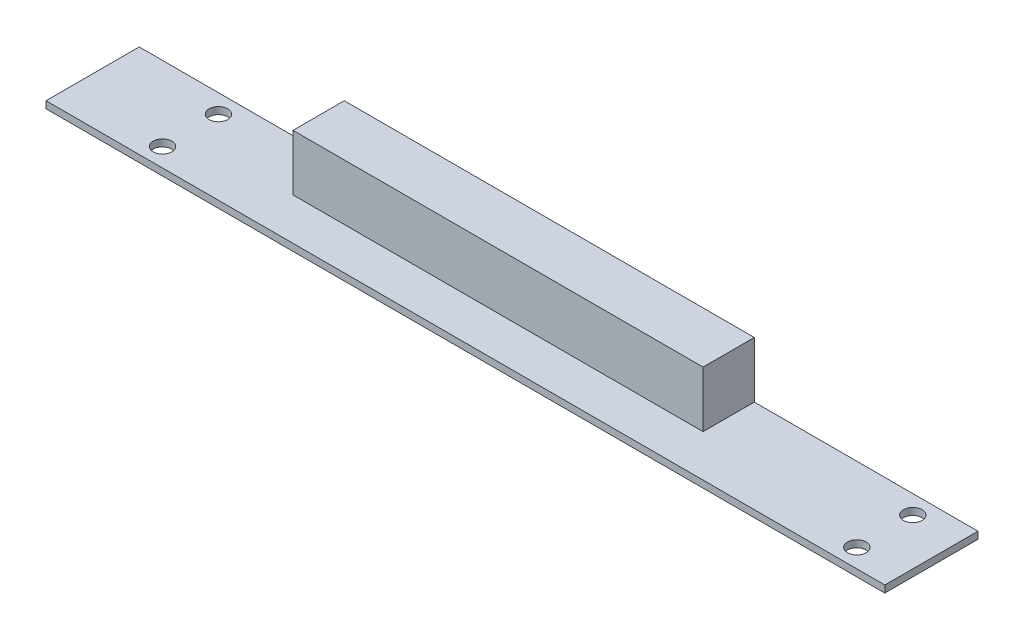
ISO-10303-21;
HEADER;
FILE_DESCRIPTION(('STEP AP214'),'2;1');
FILE_NAME('part.step','',(''),(''),'','','');
FILE_SCHEMA(('AUTOMOTIVE_DESIGN { 1 0 10303 214 1 1 1 1 }'));
ENDSEC;
DATA;
#1=APPLICATION_CONTEXT('core data for automotive mechanical design processes');
#2=APPLICATION_PROTOCOL_DEFINITION('international standard','automotive_design',2000,#1);
#3=PRODUCT_CONTEXT('',#1,'mechanical');
#4=PRODUCT('Part','Part','',(#3));
#5=PRODUCT_RELATED_PRODUCT_CATEGORY('part','',(#4));
#6=PRODUCT_DEFINITION_FORMATION('','',#4);
#7=PRODUCT_DEFINITION_CONTEXT('part definition',#1,'design');
#8=PRODUCT_DEFINITION('design','',#6,#7);
#9=PRODUCT_DEFINITION_SHAPE('','',#8);
#10=(LENGTH_UNIT() NAMED_UNIT(*) SI_UNIT(.MILLI.,.METRE.));
#11=(NAMED_UNIT(*) PLANE_ANGLE_UNIT() SI_UNIT($,.RADIAN.));
#12=(NAMED_UNIT(*) SI_UNIT($,.STERADIAN.) SOLID_ANGLE_UNIT());
#13=UNCERTAINTY_MEASURE_WITH_UNIT(LENGTH_MEASURE(1.E-05),#10,'distance_accuracy_value','');
#14=(GEOMETRIC_REPRESENTATION_CONTEXT(3) GLOBAL_UNCERTAINTY_ASSIGNED_CONTEXT((#13)) GLOBAL_UNIT_ASSIGNED_CONTEXT((#10,
#11,#12)) REPRESENTATION_CONTEXT('',''));
#15=CARTESIAN_POINT('',(0.,0.,0.));
#16=DIRECTION('',(0.,0.,1.));
#17=DIRECTION('',(1.,0.,0.));
#18=AXIS2_PLACEMENT_3D('',#15,#16,#17);
#19=CARTESIAN_POINT('',(89.9999999999999,1.5,-10.));
#20=DIRECTION('',(0.,-1.,0.));
#21=DIRECTION('',(0.,0.,-1.));
#22=AXIS2_PLACEMENT_3D('',#19,#20,#21);
#23=PLANE('',#22);
#24=CARTESIAN_POINT('',(79.9999999999999,1.5,6.));
#25=DIRECTION('',(0.,1.,0.));
#26=DIRECTION('',(0.,0.,1.));
#27=AXIS2_PLACEMENT_3D('',#24,#25,#26);
#28=CIRCLE('',#27,2.);
#29=CARTESIAN_POINT('',(79.9999999999999,1.5,8.));
#30=VERTEX_POINT('',#29);
#31=EDGE_CURVE('E120',#30,#30,#28,.T.);
#32=ORIENTED_EDGE('',*,*,#31,.F.);
#33=EDGE_LOOP('',(#32));
#34=FACE_BOUND('',#33,.T.);
#35=CARTESIAN_POINT('',(-69.,1.5,6.));
#36=DIRECTION('',(0.,1.,0.));
#37=DIRECTION('',(0.,0.,1.));
#38=AXIS2_PLACEMENT_3D('',#35,#36,#37);
#39=CIRCLE('',#38,2.);
#40=CARTESIAN_POINT('',(-69.,1.5,8.));
#41=VERTEX_POINT('',#40);
#42=EDGE_CURVE('E135',#41,#41,#39,.T.);
#43=ORIENTED_EDGE('',*,*,#42,.F.);
#44=EDGE_LOOP('',(#43));
#45=FACE_BOUND('',#44,.T.);
#46=CARTESIAN_POINT('',(-69.,1.5,-6.));
#47=DIRECTION('',(0.,1.,0.));
#48=DIRECTION('',(0.,0.,1.));
#49=AXIS2_PLACEMENT_3D('',#46,#47,#48);
#50=CIRCLE('',#49,2.);
#51=CARTESIAN_POINT('',(-69.,1.5,-4.));
#52=VERTEX_POINT('',#51);
#53=EDGE_CURVE('E141',#52,#52,#50,.T.);
#54=ORIENTED_EDGE('',*,*,#53,.F.);
#55=EDGE_LOOP('',(#54));
#56=FACE_BOUND('',#55,.T.);
#57=CARTESIAN_POINT('',(79.9999999999999,1.5,-6.));
#58=DIRECTION('',(0.,1.,0.));
#59=DIRECTION('',(0.,0.,1.));
#60=AXIS2_PLACEMENT_3D('',#57,#58,#59);
#61=CIRCLE('',#60,2.);
#62=CARTESIAN_POINT('',(79.9999999999999,1.5,-4.));
#63=VERTEX_POINT('',#62);
#64=EDGE_CURVE('E129',#63,#63,#61,.T.);
#65=ORIENTED_EDGE('',*,*,#64,.F.);
#66=EDGE_LOOP('',(#65));
#67=FACE_BOUND('',#66,.T.);
#68=DIRECTION('',(0.,0.,1.));
#69=VECTOR('',#68,1.);
#70=CARTESIAN_POINT('',(-46.0000000000001,1.5,-10.));
#71=LINE('',#70,#69);
#72=CARTESIAN_POINT('',(-46.0000000000001,1.5,-10.));
#73=VERTEX_POINT('',#72);
#74=CARTESIAN_POINT('',(-46.0000000000001,1.5,1.));
#75=VERTEX_POINT('',#74);
#76=EDGE_CURVE('E52',#73,#75,#71,.T.);
#77=ORIENTED_EDGE('',*,*,#76,.F.);
#78=DIRECTION('',(-1.,0.,0.));
#79=VECTOR('',#78,1.);
#80=CARTESIAN_POINT('',(-90.0000000000001,1.5,-10.));
#81=LINE('',#80,#79);
#82=CARTESIAN_POINT('',(-90.0000000000001,1.5,-10.));
#83=VERTEX_POINT('',#82);
#84=EDGE_CURVE('E150',#73,#83,#81,.T.);
#85=ORIENTED_EDGE('',*,*,#84,.T.);
#86=DIRECTION('',(0.,0.,1.));
#87=VECTOR('',#86,1.);
#88=CARTESIAN_POINT('',(-90.0000000000001,1.5,10.));
#89=LINE('',#88,#87);
#90=CARTESIAN_POINT('',(-90.0000000000001,1.5,10.));
#91=VERTEX_POINT('',#90);
#92=EDGE_CURVE('E154',#83,#91,#89,.T.);
#93=ORIENTED_EDGE('',*,*,#92,.T.);
#94=DIRECTION('',(1.,0.,0.));
#95=VECTOR('',#94,1.);
#96=CARTESIAN_POINT('',(-90.0000000000001,1.5,10.));
#97=LINE('',#96,#95);
#98=CARTESIAN_POINT('',(89.9999999999999,1.5,10.));
#99=VERTEX_POINT('',#98);
#100=EDGE_CURVE('E170',#91,#99,#97,.T.);
#101=ORIENTED_EDGE('',*,*,#100,.T.);
#102=DIRECTION('',(0.,0.,-1.));
#103=VECTOR('',#102,1.);
#104=CARTESIAN_POINT('',(89.9999999999999,1.5,10.));
#105=LINE('',#104,#103);
#106=CARTESIAN_POINT('',(89.9999999999999,1.5,-10.));
#107=VERTEX_POINT('',#106);
#108=EDGE_CURVE('E147',#99,#107,#105,.T.);
#109=ORIENTED_EDGE('',*,*,#108,.T.);
#110=CARTESIAN_POINT('',(41.9999999999998,1.5,-10.));
#111=VERTEX_POINT('',#110);
#112=EDGE_CURVE('E160',#107,#111,#81,.T.);
#113=ORIENTED_EDGE('',*,*,#112,.T.);
#114=DIRECTION('',(0.,0.,-1.));
#115=VECTOR('',#114,1.);
#116=CARTESIAN_POINT('',(41.9999999999999,1.5,-10.));
#117=LINE('',#116,#115);
#118=CARTESIAN_POINT('',(41.9999999999999,1.5,0.999999999999994));
#119=VERTEX_POINT('',#118);
#120=EDGE_CURVE('E114',#119,#111,#117,.T.);
#121=ORIENTED_EDGE('',*,*,#120,.F.);
#122=DIRECTION('',(1.,0.,0.));
#123=VECTOR('',#122,1.);
#124=CARTESIAN_POINT('',(-46.0000000000001,1.5,1.));
#125=LINE('',#124,#123);
#126=EDGE_CURVE('E47',#75,#119,#125,.T.);
#127=ORIENTED_EDGE('',*,*,#126,.F.);
#128=EDGE_LOOP('',(#77,#85,#93,#101,#109,#113,#121,#127));
#129=FACE_BOUND('',#128,.T.);
#130=ADVANCED_FACE('F30',(#34,#45,#56,#67,#129),#23,.F.);
#131=CARTESIAN_POINT('',(89.9999999999999,0.,-10.));
#132=DIRECTION('',(0.,-1.,0.));
#133=DIRECTION('',(0.,0.,-1.));
#134=AXIS2_PLACEMENT_3D('',#131,#132,#133);
#135=PLANE('',#134);
#136=CARTESIAN_POINT('',(79.9999999999999,0.,-6.));
#137=DIRECTION('',(0.,1.,0.));
#138=DIRECTION('',(0.,0.,1.));
#139=AXIS2_PLACEMENT_3D('',#136,#137,#138);
#140=CIRCLE('',#139,2.);
#141=CARTESIAN_POINT('',(79.9999999999999,0.,-4.));
#142=VERTEX_POINT('',#141);
#143=EDGE_CURVE('E127',#142,#142,#140,.T.);
#144=ORIENTED_EDGE('',*,*,#143,.T.);
#145=EDGE_LOOP('',(#144));
#146=FACE_BOUND('',#145,.T.);
#147=CARTESIAN_POINT('',(-69.,0.,-6.));
#148=DIRECTION('',(0.,1.,0.));
#149=DIRECTION('',(0.,0.,1.));
#150=AXIS2_PLACEMENT_3D('',#147,#148,#149);
#151=CIRCLE('',#150,2.);
#152=CARTESIAN_POINT('',(-69.,0.,-4.));
#153=VERTEX_POINT('',#152);
#154=EDGE_CURVE('E138',#153,#153,#151,.T.);
#155=ORIENTED_EDGE('',*,*,#154,.T.);
#156=EDGE_LOOP('',(#155));
#157=FACE_BOUND('',#156,.T.);
#158=DIRECTION('',(0.,0.,-1.));
#159=VECTOR('',#158,1.);
#160=CARTESIAN_POINT('',(89.9999999999999,0.,10.));
#161=LINE('',#160,#159);
#162=CARTESIAN_POINT('',(89.9999999999999,0.,10.));
#163=VERTEX_POINT('',#162);
#164=CARTESIAN_POINT('',(89.9999999999999,0.,-10.));
#165=VERTEX_POINT('',#164);
#166=EDGE_CURVE('E144',#163,#165,#161,.T.);
#167=ORIENTED_EDGE('',*,*,#166,.F.);
#168=DIRECTION('',(1.,0.,0.));
#169=VECTOR('',#168,1.);
#170=CARTESIAN_POINT('',(-90.0000000000001,0.,10.));
#171=LINE('',#170,#169);
#172=CARTESIAN_POINT('',(-90.0000000000001,0.,10.));
#173=VERTEX_POINT('',#172);
#174=EDGE_CURVE('E151',#173,#163,#171,.T.);
#175=ORIENTED_EDGE('',*,*,#174,.F.);
#176=DIRECTION('',(0.,0.,1.));
#177=VECTOR('',#176,1.);
#178=CARTESIAN_POINT('',(-90.0000000000001,0.,10.));
#179=LINE('',#178,#177);
#180=CARTESIAN_POINT('',(-90.0000000000001,0.,-10.));
#181=VERTEX_POINT('',#180);
#182=EDGE_CURVE('E172',#181,#173,#179,.T.);
#183=ORIENTED_EDGE('',*,*,#182,.F.);
#184=DIRECTION('',(-1.,0.,0.));
#185=VECTOR('',#184,1.);
#186=CARTESIAN_POINT('',(-90.0000000000001,0.,-10.));
#187=LINE('',#186,#185);
#188=EDGE_CURVE('E174',#165,#181,#187,.T.);
#189=ORIENTED_EDGE('',*,*,#188,.F.);
#190=EDGE_LOOP('',(#167,#175,#183,#189));
#191=FACE_BOUND('',#190,.T.);
#192=CARTESIAN_POINT('',(-69.,0.,6.));
#193=DIRECTION('',(0.,1.,0.));
#194=DIRECTION('',(0.,0.,1.));
#195=AXIS2_PLACEMENT_3D('',#192,#193,#194);
#196=CIRCLE('',#195,2.);
#197=CARTESIAN_POINT('',(-69.,0.,8.));
#198=VERTEX_POINT('',#197);
#199=EDGE_CURVE('E132',#198,#198,#196,.T.);
#200=ORIENTED_EDGE('',*,*,#199,.T.);
#201=EDGE_LOOP('',(#200));
#202=FACE_BOUND('',#201,.T.);
#203=CARTESIAN_POINT('',(79.9999999999999,0.,6.));
#204=DIRECTION('',(0.,1.,0.));
#205=DIRECTION('',(0.,0.,1.));
#206=AXIS2_PLACEMENT_3D('',#203,#204,#205);
#207=CIRCLE('',#206,2.);
#208=CARTESIAN_POINT('',(79.9999999999999,0.,8.));
#209=VERTEX_POINT('',#208);
#210=EDGE_CURVE('E117',#209,#209,#207,.T.);
#211=ORIENTED_EDGE('',*,*,#210,.T.);
#212=EDGE_LOOP('',(#211));
#213=FACE_BOUND('',#212,.T.);
#214=ADVANCED_FACE('F211',(#146,#157,#191,#202,#213),#135,.T.);
#215=CARTESIAN_POINT('',(89.9999999999999,1.5,10.));
#216=DIRECTION('',(-1.,0.,0.));
#217=DIRECTION('',(0.,0.,1.));
#218=AXIS2_PLACEMENT_3D('',#215,#216,#217);
#219=PLANE('',#218);
#220=ORIENTED_EDGE('',*,*,#166,.T.);
#221=DIRECTION('',(0.,-1.,0.));
#222=VECTOR('',#221,1.);
#223=CARTESIAN_POINT('',(89.9999999999999,1.5,-10.));
#224=LINE('',#223,#222);
#225=EDGE_CURVE('E11',#107,#165,#224,.T.);
#226=ORIENTED_EDGE('',*,*,#225,.F.);
#227=ORIENTED_EDGE('',*,*,#108,.F.);
#228=DIRECTION('',(0.,-1.,0.));
#229=VECTOR('',#228,1.);
#230=CARTESIAN_POINT('',(89.9999999999999,1.5,10.));
#231=LINE('',#230,#229);
#232=EDGE_CURVE('E167',#99,#163,#231,.T.);
#233=ORIENTED_EDGE('',*,*,#232,.T.);
#234=EDGE_LOOP('',(#220,#226,#227,#233));
#235=FACE_BOUND('',#234,.T.);
#236=ADVANCED_FACE('F32',(#235),#219,.F.);
#237=CARTESIAN_POINT('',(-90.0000000000001,1.5,-10.));
#238=DIRECTION('',(0.,0.,1.));
#239=DIRECTION('',(1.,0.,0.));
#240=AXIS2_PLACEMENT_3D('',#237,#238,#239);
#241=PLANE('',#240);
#242=ORIENTED_EDGE('',*,*,#188,.T.);
#243=DIRECTION('',(0.,-1.,0.));
#244=VECTOR('',#243,1.);
#245=CARTESIAN_POINT('',(-90.0000000000001,1.5,-10.));
#246=LINE('',#245,#244);
#247=EDGE_CURVE('E39',#83,#181,#246,.T.);
#248=ORIENTED_EDGE('',*,*,#247,.F.);
#249=ORIENTED_EDGE('',*,*,#84,.F.);
#250=DIRECTION('',(0.,-1.,0.));
#251=VECTOR('',#250,1.);
#252=CARTESIAN_POINT('',(-46.0000000000001,13.5,-10.));
#253=LINE('',#252,#251);
#254=CARTESIAN_POINT('',(-46.0000000000001,13.5,-10.));
#255=VERTEX_POINT('',#254);
#256=EDGE_CURVE('E200',#255,#73,#253,.T.);
#257=ORIENTED_EDGE('',*,*,#256,.F.);
#258=DIRECTION('',(-1.,0.,0.));
#259=VECTOR('',#258,1.);
#260=CARTESIAN_POINT('',(-46.0000000000001,13.5,-10.));
#261=LINE('',#260,#259);
#262=CARTESIAN_POINT('',(41.9999999999999,13.5,-10.));
#263=VERTEX_POINT('',#262);
#264=EDGE_CURVE('E110',#263,#255,#261,.T.);
#265=ORIENTED_EDGE('',*,*,#264,.F.);
#266=DIRECTION('',(0.,-1.,0.));
#267=VECTOR('',#266,1.);
#268=CARTESIAN_POINT('',(41.9999999999999,13.5,-10.));
#269=LINE('',#268,#267);
#270=EDGE_CURVE('E122',#263,#111,#269,.T.);
#271=ORIENTED_EDGE('',*,*,#270,.T.);
#272=ORIENTED_EDGE('',*,*,#112,.F.);
#273=ORIENTED_EDGE('',*,*,#225,.T.);
#274=EDGE_LOOP('',(#242,#248,#249,#257,#265,#271,#272,#273));
#275=FACE_BOUND('',#274,.T.);
#276=ADVANCED_FACE('F199',(#275),#241,.F.);
#277=CARTESIAN_POINT('',(-90.0000000000001,1.5,10.));
#278=DIRECTION('',(1.,0.,0.));
#279=DIRECTION('',(0.,0.,-1.));
#280=AXIS2_PLACEMENT_3D('',#277,#278,#279);
#281=PLANE('',#280);
#282=ORIENTED_EDGE('',*,*,#182,.T.);
#283=DIRECTION('',(0.,-1.,0.));
#284=VECTOR('',#283,1.);
#285=CARTESIAN_POINT('',(-90.0000000000001,1.5,10.));
#286=LINE('',#285,#284);
#287=EDGE_CURVE('E164',#91,#173,#286,.T.);
#288=ORIENTED_EDGE('',*,*,#287,.F.);
#289=ORIENTED_EDGE('',*,*,#92,.F.);
#290=ORIENTED_EDGE('',*,*,#247,.T.);
#291=EDGE_LOOP('',(#282,#288,#289,#290));
#292=FACE_BOUND('',#291,.T.);
#293=ADVANCED_FACE('F183',(#292),#281,.F.);
#294=CARTESIAN_POINT('',(-90.0000000000001,1.5,10.));
#295=DIRECTION('',(0.,0.,-1.));
#296=DIRECTION('',(-1.,0.,0.));
#297=AXIS2_PLACEMENT_3D('',#294,#295,#296);
#298=PLANE('',#297);
#299=ORIENTED_EDGE('',*,*,#174,.T.);
#300=ORIENTED_EDGE('',*,*,#232,.F.);
#301=ORIENTED_EDGE('',*,*,#100,.F.);
#302=ORIENTED_EDGE('',*,*,#287,.T.);
#303=EDGE_LOOP('',(#299,#300,#301,#302));
#304=FACE_BOUND('',#303,.T.);
#305=ADVANCED_FACE('F187',(#304),#298,.F.);
#306=CARTESIAN_POINT('',(-69.,1.5,-6.));
#307=DIRECTION('',(0.,-1.,0.));
#308=DIRECTION('',(0.,0.,-1.));
#309=AXIS2_PLACEMENT_3D('',#306,#307,#308);
#310=CYLINDRICAL_SURFACE('',#309,2.);
#311=ORIENTED_EDGE('',*,*,#53,.T.);
#312=EDGE_LOOP('',(#311));
#313=FACE_BOUND('',#312,.T.);
#314=ORIENTED_EDGE('',*,*,#154,.F.);
#315=EDGE_LOOP('',(#314));
#316=FACE_BOUND('',#315,.T.);
#317=ADVANCED_FACE('F241',(#313,#316),#310,.F.);
#318=CARTESIAN_POINT('',(-69.,1.5,6.));
#319=DIRECTION('',(0.,-1.,0.));
#320=DIRECTION('',(0.,0.,-1.));
#321=AXIS2_PLACEMENT_3D('',#318,#319,#320);
#322=CYLINDRICAL_SURFACE('',#321,2.);
#323=ORIENTED_EDGE('',*,*,#42,.T.);
#324=EDGE_LOOP('',(#323));
#325=FACE_BOUND('',#324,.T.);
#326=ORIENTED_EDGE('',*,*,#199,.F.);
#327=EDGE_LOOP('',(#326));
#328=FACE_BOUND('',#327,.T.);
#329=ADVANCED_FACE('F230',(#325,#328),#322,.F.);
#330=CARTESIAN_POINT('',(79.9999999999999,1.5,-6.));
#331=DIRECTION('',(0.,-1.,0.));
#332=DIRECTION('',(0.,0.,-1.));
#333=AXIS2_PLACEMENT_3D('',#330,#331,#332);
#334=CYLINDRICAL_SURFACE('',#333,2.);
#335=ORIENTED_EDGE('',*,*,#64,.T.);
#336=EDGE_LOOP('',(#335));
#337=FACE_BOUND('',#336,.T.);
#338=ORIENTED_EDGE('',*,*,#143,.F.);
#339=EDGE_LOOP('',(#338));
#340=FACE_BOUND('',#339,.T.);
#341=ADVANCED_FACE('F222',(#337,#340),#334,.F.);
#342=CARTESIAN_POINT('',(79.9999999999999,1.5,6.));
#343=DIRECTION('',(0.,-1.,0.));
#344=DIRECTION('',(0.,0.,-1.));
#345=AXIS2_PLACEMENT_3D('',#342,#343,#344);
#346=CYLINDRICAL_SURFACE('',#345,2.);
#347=ORIENTED_EDGE('',*,*,#31,.T.);
#348=EDGE_LOOP('',(#347));
#349=FACE_BOUND('',#348,.T.);
#350=ORIENTED_EDGE('',*,*,#210,.F.);
#351=EDGE_LOOP('',(#350));
#352=FACE_BOUND('',#351,.T.);
#353=ADVANCED_FACE('F220',(#349,#352),#346,.F.);
#354=CARTESIAN_POINT('',(-46.0000000000001,13.5,-10.));
#355=DIRECTION('',(1.,0.,0.));
#356=DIRECTION('',(0.,0.,-1.));
#357=AXIS2_PLACEMENT_3D('',#354,#355,#356);
#358=PLANE('',#357);
#359=ORIENTED_EDGE('',*,*,#76,.T.);
#360=DIRECTION('',(0.,-1.,0.));
#361=VECTOR('',#360,1.);
#362=CARTESIAN_POINT('',(-46.0000000000001,13.5,1.));
#363=LINE('',#362,#361);
#364=CARTESIAN_POINT('',(-46.0000000000001,13.5,1.));
#365=VERTEX_POINT('',#364);
#366=EDGE_CURVE('E99',#365,#75,#363,.T.);
#367=ORIENTED_EDGE('',*,*,#366,.F.);
#368=DIRECTION('',(0.,0.,1.));
#369=VECTOR('',#368,1.);
#370=CARTESIAN_POINT('',(-46.0000000000001,13.5,-10.));
#371=LINE('',#370,#369);
#372=EDGE_CURVE('E105',#255,#365,#371,.T.);
#373=ORIENTED_EDGE('',*,*,#372,.F.);
#374=ORIENTED_EDGE('',*,*,#256,.T.);
#375=EDGE_LOOP('',(#359,#367,#373,#374));
#376=FACE_BOUND('',#375,.T.);
#377=ADVANCED_FACE('F116',(#376),#358,.F.);
#378=CARTESIAN_POINT('',(-46.0000000000001,13.5,1.));
#379=DIRECTION('',(0.,0.,-1.));
#380=DIRECTION('',(-1.,0.,0.));
#381=AXIS2_PLACEMENT_3D('',#378,#379,#380);
#382=PLANE('',#381);
#383=ORIENTED_EDGE('',*,*,#126,.T.);
#384=DIRECTION('',(0.,-1.,0.));
#385=VECTOR('',#384,1.);
#386=CARTESIAN_POINT('',(41.9999999999999,13.5,0.999999999999994));
#387=LINE('',#386,#385);
#388=CARTESIAN_POINT('',(41.9999999999999,13.5,0.999999999999994));
#389=VERTEX_POINT('',#388);
#390=EDGE_CURVE('E101',#389,#119,#387,.T.);
#391=ORIENTED_EDGE('',*,*,#390,.F.);
#392=DIRECTION('',(1.,0.,0.));
#393=VECTOR('',#392,1.);
#394=CARTESIAN_POINT('',(-46.0000000000001,13.5,1.));
#395=LINE('',#394,#393);
#396=EDGE_CURVE('E95',#365,#389,#395,.T.);
#397=ORIENTED_EDGE('',*,*,#396,.F.);
#398=ORIENTED_EDGE('',*,*,#366,.T.);
#399=EDGE_LOOP('',(#383,#391,#397,#398));
#400=FACE_BOUND('',#399,.T.);
#401=ADVANCED_FACE('F97',(#400),#382,.F.);
#402=CARTESIAN_POINT('',(41.9999999999999,13.5,-10.));
#403=DIRECTION('',(-1.,0.,0.));
#404=DIRECTION('',(0.,0.,1.));
#405=AXIS2_PLACEMENT_3D('',#402,#403,#404);
#406=PLANE('',#405);
#407=ORIENTED_EDGE('',*,*,#120,.T.);
#408=ORIENTED_EDGE('',*,*,#270,.F.);
#409=DIRECTION('',(0.,0.,-1.));
#410=VECTOR('',#409,1.);
#411=CARTESIAN_POINT('',(41.9999999999999,13.5,-10.));
#412=LINE('',#411,#410);
#413=EDGE_CURVE('E104',#389,#263,#412,.T.);
#414=ORIENTED_EDGE('',*,*,#413,.F.);
#415=ORIENTED_EDGE('',*,*,#390,.T.);
#416=EDGE_LOOP('',(#407,#408,#414,#415));
#417=FACE_BOUND('',#416,.T.);
#418=ADVANCED_FACE('F197',(#417),#406,.F.);
#419=CARTESIAN_POINT('',(-46.0000000000001,13.5,1.));
#420=DIRECTION('',(0.,1.,0.));
#421=DIRECTION('',(0.,0.,1.));
#422=AXIS2_PLACEMENT_3D('',#419,#420,#421);
#423=PLANE('',#422);
#424=ORIENTED_EDGE('',*,*,#372,.T.);
#425=ORIENTED_EDGE('',*,*,#396,.T.);
#426=ORIENTED_EDGE('',*,*,#413,.T.);
#427=ORIENTED_EDGE('',*,*,#264,.T.);
#428=EDGE_LOOP('',(#424,#425,#426,#427));
#429=FACE_BOUND('',#428,.T.);
#430=ADVANCED_FACE('F108',(#429),#423,.T.);
#431=CLOSED_SHELL('',(#130,#214,#236,#276,#293,#305,#317,#329,#341,#353,#377,#401,#418,#430));
#432=MANIFOLD_SOLID_BREP('B2',#431);
#433=ADVANCED_BREP_SHAPE_REPRESENTATION('',(#18,#432),#14);
#434=SHAPE_DEFINITION_REPRESENTATION(#9,#433);
ENDSEC;
END-ISO-10303-21;
